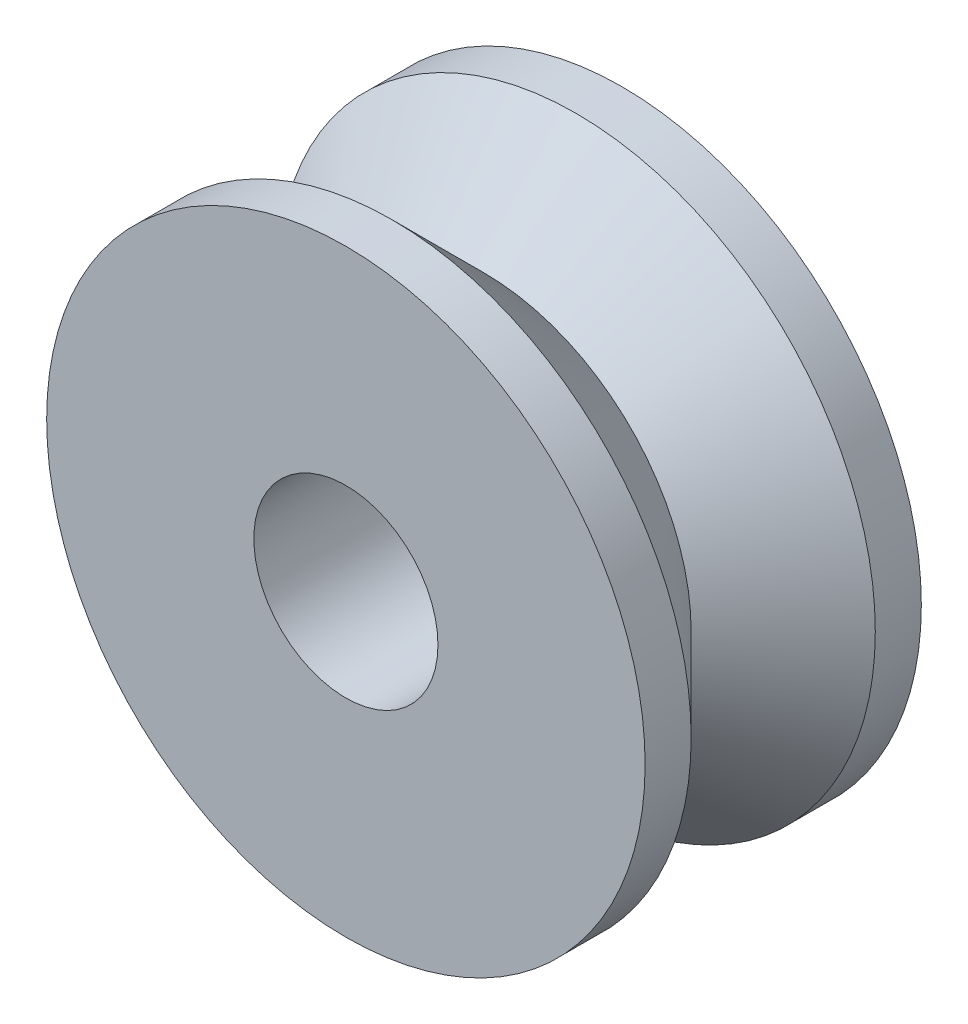
ISO-10303-21;
HEADER;
FILE_DESCRIPTION(('STEP AP214'),'2;1');
FILE_NAME('part.step','',(''),(''),'','','');
FILE_SCHEMA(('AUTOMOTIVE_DESIGN { 1 0 10303 214 1 1 1 1 }'));
ENDSEC;
DATA;
#1=APPLICATION_CONTEXT('core data for automotive mechanical design processes');
#2=APPLICATION_PROTOCOL_DEFINITION('international standard','automotive_design',2000,#1);
#3=PRODUCT_CONTEXT('',#1,'mechanical');
#4=PRODUCT('Part','Part','',(#3));
#5=PRODUCT_RELATED_PRODUCT_CATEGORY('part','',(#4));
#6=PRODUCT_DEFINITION_FORMATION('','',#4);
#7=PRODUCT_DEFINITION_CONTEXT('part definition',#1,'design');
#8=PRODUCT_DEFINITION('design','',#6,#7);
#9=PRODUCT_DEFINITION_SHAPE('','',#8);
#10=(LENGTH_UNIT() NAMED_UNIT(*) SI_UNIT(.MILLI.,.METRE.));
#11=(NAMED_UNIT(*) PLANE_ANGLE_UNIT() SI_UNIT($,.RADIAN.));
#12=(NAMED_UNIT(*) SI_UNIT($,.STERADIAN.) SOLID_ANGLE_UNIT());
#13=UNCERTAINTY_MEASURE_WITH_UNIT(LENGTH_MEASURE(1.E-05),#10,'distance_accuracy_value','');
#14=(GEOMETRIC_REPRESENTATION_CONTEXT(3) GLOBAL_UNCERTAINTY_ASSIGNED_CONTEXT((#13)) GLOBAL_UNIT_ASSIGNED_CONTEXT((#10,
#11,#12)) REPRESENTATION_CONTEXT('',''));
#15=CARTESIAN_POINT('',(0.,0.,0.));
#16=DIRECTION('',(0.,0.,1.));
#17=DIRECTION('',(1.,0.,0.));
#18=AXIS2_PLACEMENT_3D('',#15,#16,#17);
#19=CARTESIAN_POINT('',(0.,0.,0.));
#20=DIRECTION('',(0.,0.,1.));
#21=DIRECTION('',(1.,0.,0.));
#22=AXIS2_PLACEMENT_3D('',#19,#20,#21);
#23=PLANE('',#22);
#24=CARTESIAN_POINT('',(0.,0.,0.));
#25=DIRECTION('',(0.,0.,1.));
#26=DIRECTION('',(1.,0.,0.));
#27=AXIS2_PLACEMENT_3D('',#24,#25,#26);
#28=CIRCLE('',#27,1.99999999999999);
#29=CARTESIAN_POINT('',(1.99999999999999,0.,0.));
#30=VERTEX_POINT('',#29);
#31=EDGE_CURVE('E52',#30,#30,#28,.T.);
#32=ORIENTED_EDGE('',*,*,#31,.T.);
#33=EDGE_LOOP('',(#32));
#34=FACE_BOUND('',#33,.T.);
#35=CARTESIAN_POINT('',(0.,0.,0.));
#36=DIRECTION('',(0.,0.,1.));
#37=DIRECTION('',(1.,0.,0.));
#38=AXIS2_PLACEMENT_3D('',#35,#36,#37);
#39=CIRCLE('',#38,6.5);
#40=CARTESIAN_POINT('',(6.5,0.,0.));
#41=VERTEX_POINT('',#40);
#42=EDGE_CURVE('E10',#41,#41,#39,.T.);
#43=ORIENTED_EDGE('',*,*,#42,.F.);
#44=EDGE_LOOP('',(#43));
#45=FACE_BOUND('',#44,.T.);
#46=ADVANCED_FACE('F30',(#34,#45),#23,.F.);
#47=CARTESIAN_POINT('',(0.,0.,55.));
#48=DIRECTION('',(0.,0.,1.));
#49=DIRECTION('',(1.,0.,0.));
#50=AXIS2_PLACEMENT_3D('',#47,#48,#49);
#51=CYLINDRICAL_SURFACE('',#50,6.5);
#52=CARTESIAN_POINT('',(0.,0.,1.));
#53=DIRECTION('',(0.,0.,1.));
#54=DIRECTION('',(1.,0.,0.));
#55=AXIS2_PLACEMENT_3D('',#52,#53,#54);
#56=CIRCLE('',#55,6.5);
#57=CARTESIAN_POINT('',(6.5,0.,1.));
#58=VERTEX_POINT('',#57);
#59=EDGE_CURVE('E36',#58,#58,#56,.T.);
#60=ORIENTED_EDGE('',*,*,#59,.F.);
#61=EDGE_LOOP('',(#60));
#62=FACE_BOUND('',#61,.T.);
#63=ORIENTED_EDGE('',*,*,#42,.T.);
#64=EDGE_LOOP('',(#63));
#65=FACE_BOUND('',#64,.T.);
#66=ADVANCED_FACE('F81',(#62,#65),#51,.T.);
#67=CARTESIAN_POINT('',(0.,0.,1.));
#68=DIRECTION('',(0.,0.,-1.));
#69=DIRECTION('',(-1.,0.,0.));
#70=AXIS2_PLACEMENT_3D('',#67,#68,#69);
#71=CONICAL_SURFACE('',#70,6.5,0.78539816339745);
#72=CARTESIAN_POINT('',(0.,0.,3.));
#73=DIRECTION('',(0.,0.,1.));
#74=DIRECTION('',(1.,0.,0.));
#75=AXIS2_PLACEMENT_3D('',#72,#73,#74);
#76=CIRCLE('',#75,4.49999999999999);
#77=CARTESIAN_POINT('',(4.49999999999999,0.,3.));
#78=VERTEX_POINT('',#77);
#79=EDGE_CURVE('E40',#78,#78,#76,.T.);
#80=ORIENTED_EDGE('',*,*,#79,.F.);
#81=EDGE_LOOP('',(#80));
#82=FACE_BOUND('',#81,.T.);
#83=ORIENTED_EDGE('',*,*,#59,.T.);
#84=EDGE_LOOP('',(#83));
#85=FACE_BOUND('',#84,.T.);
#86=ADVANCED_FACE('F76',(#82,#85),#71,.T.);
#87=CARTESIAN_POINT('',(0.,0.,3.));
#88=DIRECTION('',(0.,0.,1.));
#89=DIRECTION('',(1.,0.,0.));
#90=AXIS2_PLACEMENT_3D('',#87,#88,#89);
#91=CONICAL_SURFACE('',#90,4.49999999999999,0.785398163397452);
#92=CARTESIAN_POINT('',(0.,0.,5.));
#93=DIRECTION('',(0.,0.,1.));
#94=DIRECTION('',(1.,0.,0.));
#95=AXIS2_PLACEMENT_3D('',#92,#93,#94);
#96=CIRCLE('',#95,6.5);
#97=CARTESIAN_POINT('',(6.5,0.,5.));
#98=VERTEX_POINT('',#97);
#99=EDGE_CURVE('E44',#98,#98,#96,.T.);
#100=ORIENTED_EDGE('',*,*,#99,.F.);
#101=EDGE_LOOP('',(#100));
#102=FACE_BOUND('',#101,.T.);
#103=ORIENTED_EDGE('',*,*,#79,.T.);
#104=EDGE_LOOP('',(#103));
#105=FACE_BOUND('',#104,.T.);
#106=ADVANCED_FACE('F70',(#102,#105),#91,.T.);
#107=CARTESIAN_POINT('',(0.,0.,55.));
#108=DIRECTION('',(0.,0.,1.));
#109=DIRECTION('',(1.,0.,0.));
#110=AXIS2_PLACEMENT_3D('',#107,#108,#109);
#111=CYLINDRICAL_SURFACE('',#110,6.5);
#112=CARTESIAN_POINT('',(0.,0.,6.));
#113=DIRECTION('',(0.,0.,1.));
#114=DIRECTION('',(1.,0.,0.));
#115=AXIS2_PLACEMENT_3D('',#112,#113,#114);
#116=CIRCLE('',#115,6.5);
#117=CARTESIAN_POINT('',(6.5,0.,6.));
#118=VERTEX_POINT('',#117);
#119=EDGE_CURVE('E49',#118,#118,#116,.T.);
#120=ORIENTED_EDGE('',*,*,#119,.F.);
#121=EDGE_LOOP('',(#120));
#122=FACE_BOUND('',#121,.T.);
#123=ORIENTED_EDGE('',*,*,#99,.T.);
#124=EDGE_LOOP('',(#123));
#125=FACE_BOUND('',#124,.T.);
#126=ADVANCED_FACE('F64',(#122,#125),#111,.T.);
#127=CARTESIAN_POINT('',(0.,6.5,6.));
#128=DIRECTION('',(0.,0.,-1.));
#129=DIRECTION('',(-1.,0.,0.));
#130=AXIS2_PLACEMENT_3D('',#127,#128,#129);
#131=PLANE('',#130);
#132=CARTESIAN_POINT('',(0.,0.,6.));
#133=DIRECTION('',(0.,0.,1.));
#134=DIRECTION('',(1.,0.,0.));
#135=AXIS2_PLACEMENT_3D('',#132,#133,#134);
#136=CIRCLE('',#135,1.99999999999999);
#137=CARTESIAN_POINT('',(1.99999999999999,0.,6.));
#138=VERTEX_POINT('',#137);
#139=EDGE_CURVE('E55',#138,#138,#136,.T.);
#140=ORIENTED_EDGE('',*,*,#139,.F.);
#141=EDGE_LOOP('',(#140));
#142=FACE_BOUND('',#141,.T.);
#143=ORIENTED_EDGE('',*,*,#119,.T.);
#144=EDGE_LOOP('',(#143));
#145=FACE_BOUND('',#144,.T.);
#146=ADVANCED_FACE('F61',(#142,#145),#131,.F.);
#147=CARTESIAN_POINT('',(0.,0.,6.));
#148=DIRECTION('',(0.,0.,1.));
#149=DIRECTION('',(1.,0.,0.));
#150=AXIS2_PLACEMENT_3D('',#147,#148,#149);
#151=CYLINDRICAL_SURFACE('',#150,1.99999999999999);
#152=ORIENTED_EDGE('',*,*,#31,.F.);
#153=EDGE_LOOP('',(#152));
#154=FACE_BOUND('',#153,.T.);
#155=ORIENTED_EDGE('',*,*,#139,.T.);
#156=EDGE_LOOP('',(#155));
#157=FACE_BOUND('',#156,.T.);
#158=ADVANCED_FACE('F59',(#154,#157),#151,.F.);
#159=CLOSED_SHELL('',(#46,#66,#86,#106,#126,#146,#158));
#160=MANIFOLD_SOLID_BREP('B2',#159);
#161=ADVANCED_BREP_SHAPE_REPRESENTATION('',(#18,#160),#14);
#162=SHAPE_DEFINITION_REPRESENTATION(#9,#161);
ENDSEC;
END-ISO-10303-21;
